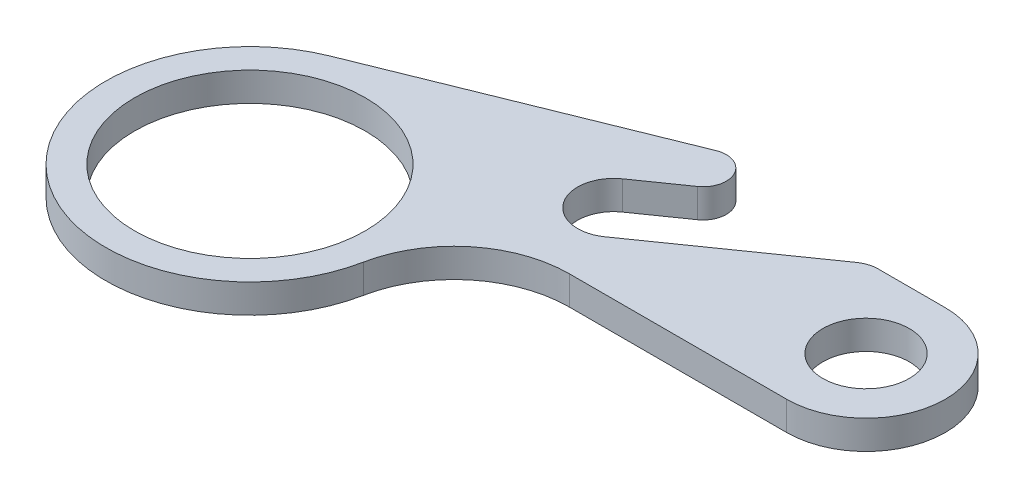
ISO-10303-21;
HEADER;
FILE_DESCRIPTION(('STEP AP214'),'2;1');
FILE_NAME('part.step','',(''),(''),'','','');
FILE_SCHEMA(('AUTOMOTIVE_DESIGN { 1 0 10303 214 1 1 1 1 }'));
ENDSEC;
DATA;
#1=APPLICATION_CONTEXT('core data for automotive mechanical design processes');
#2=APPLICATION_PROTOCOL_DEFINITION('international standard','automotive_design',2000,#1);
#3=PRODUCT_CONTEXT('',#1,'mechanical');
#4=PRODUCT('Part','Part','',(#3));
#5=PRODUCT_RELATED_PRODUCT_CATEGORY('part','',(#4));
#6=PRODUCT_DEFINITION_FORMATION('','',#4);
#7=PRODUCT_DEFINITION_CONTEXT('part definition',#1,'design');
#8=PRODUCT_DEFINITION('design','',#6,#7);
#9=PRODUCT_DEFINITION_SHAPE('','',#8);
#10=(LENGTH_UNIT() NAMED_UNIT(*) SI_UNIT(.MILLI.,.METRE.));
#11=(NAMED_UNIT(*) PLANE_ANGLE_UNIT() SI_UNIT($,.RADIAN.));
#12=(NAMED_UNIT(*) SI_UNIT($,.STERADIAN.) SOLID_ANGLE_UNIT());
#13=UNCERTAINTY_MEASURE_WITH_UNIT(LENGTH_MEASURE(1.E-05),#10,'distance_accuracy_value','');
#14=(GEOMETRIC_REPRESENTATION_CONTEXT(3) GLOBAL_UNCERTAINTY_ASSIGNED_CONTEXT((#13)) GLOBAL_UNIT_ASSIGNED_CONTEXT((#10,
#11,#12)) REPRESENTATION_CONTEXT('',''));
#15=CARTESIAN_POINT('',(0.,0.,0.));
#16=DIRECTION('',(0.,0.,1.));
#17=DIRECTION('',(1.,0.,0.));
#18=AXIS2_PLACEMENT_3D('',#15,#16,#17);
#19=CARTESIAN_POINT('',(-27.7685453845651,2.54,-3.11991027531075));
#20=DIRECTION('',(0.,-1.,0.));
#21=DIRECTION('',(0.,0.,-1.));
#22=AXIS2_PLACEMENT_3D('',#19,#20,#21);
#23=PLANE('',#22);
#24=CARTESIAN_POINT('',(-27.7685453845651,2.54,-3.11991027531075));
#25=DIRECTION('',(0.,1.,0.));
#26=DIRECTION('',(0.,0.,-1.));
#27=AXIS2_PLACEMENT_3D('',#24,#25,#26);
#28=CIRCLE('',#27,1.524);
#29=CARTESIAN_POINT('',(-26.8944148955661,2.54,-1.87152255981432));
#30=VERTEX_POINT('',#29);
#31=CARTESIAN_POINT('',(-28.339592887485,2.54,-4.53287904687259));
#32=VERTEX_POINT('',#31);
#33=EDGE_CURVE('E171',#30,#32,#28,.T.);
#34=ORIENTED_EDGE('',*,*,#33,.T.);
#35=DIRECTION('',(-0.927144863229556,0.,0.374703085905425));
#36=VECTOR('',#35,1.);
#37=CARTESIAN_POINT('',(-46.5153028129786,2.54,2.81278490242774));
#38=LINE('',#37,#36);
#39=CARTESIAN_POINT('',(-46.5153028129786,2.54,2.81278490242774));
#40=VERTEX_POINT('',#39);
#41=EDGE_CURVE('E104',#32,#40,#38,.T.);
#42=ORIENTED_EDGE('',*,*,#41,.T.);
#43=CARTESIAN_POINT('',(-42.9462559197294,2.54,11.6438397246893));
#44=DIRECTION('',(0.,1.,0.));
#45=DIRECTION('',(0.,0.,1.));
#46=AXIS2_PLACEMENT_3D('',#43,#44,#45);
#47=CIRCLE('',#46,9.525);
#48=CARTESIAN_POINT('',(-33.6030545237202,2.54,13.4959230580226));
#49=VERTEX_POINT('',#48);
#50=EDGE_CURVE('E195',#40,#49,#47,.T.);
#51=ORIENTED_EDGE('',*,*,#50,.T.);
#52=CARTESIAN_POINT('',(-26.1284934069128,2.54,14.9775897246893));
#53=DIRECTION('',(0.,-1.,0.));
#54=DIRECTION('',(0.,0.,-1.));
#55=AXIS2_PLACEMENT_3D('',#52,#53,#54);
#56=CIRCLE('',#55,7.62);
#57=CARTESIAN_POINT('',(-26.1284934069128,2.54,7.35758972468925));
#58=VERTEX_POINT('',#57);
#59=EDGE_CURVE('E214',#49,#58,#56,.T.);
#60=ORIENTED_EDGE('',*,*,#59,.T.);
#61=DIRECTION('',(1.,0.,0.));
#62=VECTOR('',#61,1.);
#63=CARTESIAN_POINT('',(-11.7729101562861,2.54,7.35758972468925));
#64=LINE('',#63,#62);
#65=CARTESIAN_POINT('',(-11.7729101562861,2.54,7.35758972468925));
#66=VERTEX_POINT('',#65);
#67=EDGE_CURVE('E211',#58,#66,#64,.T.);
#68=ORIENTED_EDGE('',*,*,#67,.T.);
#69=CARTESIAN_POINT('',(-11.7729101562861,2.54,2.11883972468925));
#70=DIRECTION('',(0.,1.,0.));
#71=DIRECTION('',(0.,0.,1.));
#72=AXIS2_PLACEMENT_3D('',#69,#70,#71);
#73=CIRCLE('',#72,5.23875);
#74=CARTESIAN_POINT('',(-11.7729101562861,2.54,-3.11991027531074));
#75=VERTEX_POINT('',#74);
#76=EDGE_CURVE('E213',#66,#75,#73,.T.);
#77=ORIENTED_EDGE('',*,*,#76,.T.);
#78=DIRECTION('',(-1.,0.,0.));
#79=VECTOR('',#78,1.);
#80=CARTESIAN_POINT('',(-11.7729101562861,2.54,-3.11991027531075));
#81=LINE('',#80,#79);
#82=CARTESIAN_POINT('',(-16.2077229110785,2.54,-3.11991027531074));
#83=VERTEX_POINT('',#82);
#84=EDGE_CURVE('E216',#75,#83,#81,.T.);
#85=ORIENTED_EDGE('',*,*,#84,.T.);
#86=CARTESIAN_POINT('',(-16.2077229110785,2.54,-1.21491027531075));
#87=DIRECTION('',(0.,1.,0.));
#88=DIRECTION('',(0.,0.,-1.));
#89=AXIS2_PLACEMENT_3D('',#86,#87,#88);
#90=CIRCLE('',#89,1.90500000000001);
#91=CARTESIAN_POINT('',(-17.3003860223273,2.54,-2.77539491968127));
#92=VERTEX_POINT('',#91);
#93=EDGE_CURVE('E132',#83,#92,#90,.T.);
#94=ORIENTED_EDGE('',*,*,#93,.T.);
#95=DIRECTION('',(-0.819152044288994,0.,0.573576436351042));
#96=VECTOR('',#95,1.);
#97=CARTESIAN_POINT('',(-27.0758312672252,2.54,4.06944553015243));
#98=LINE('',#97,#96);
#99=CARTESIAN_POINT('',(-27.0758312672252,2.54,4.06944553015243));
#100=VERTEX_POINT('',#99);
#101=EDGE_CURVE('E126',#92,#100,#98,.T.);
#102=ORIENTED_EDGE('',*,*,#101,.T.);
#103=CARTESIAN_POINT('',(-28.4416601562861,2.54,2.11883972468926));
#104=DIRECTION('',(0.,-1.,0.));
#105=DIRECTION('',(0.,0.,1.));
#106=AXIS2_PLACEMENT_3D('',#103,#104,#105);
#107=CIRCLE('',#106,2.38125);
#108=CARTESIAN_POINT('',(-29.807489045347,2.54,0.168233919226087));
#109=VERTEX_POINT('',#108);
#110=EDGE_CURVE('E130',#100,#109,#107,.T.);
#111=ORIENTED_EDGE('',*,*,#110,.T.);
#112=DIRECTION('',(0.819152044288994,0.,-0.573576436351042));
#113=VECTOR('',#112,1.);
#114=CARTESIAN_POINT('',(-29.807489045347,2.54,0.168233919226091));
#115=LINE('',#114,#113);
#116=EDGE_CURVE('E52',#109,#30,#115,.T.);
#117=ORIENTED_EDGE('',*,*,#116,.T.);
#118=EDGE_LOOP('',(#34,#42,#51,#60,#68,#77,#85,#94,#102,#111,#117));
#119=FACE_BOUND('',#118,.T.);
#120=CARTESIAN_POINT('',(-11.7729101562861,2.54,2.11883972468925));
#121=DIRECTION('',(0.,1.,0.));
#122=DIRECTION('',(0.,0.,1.));
#123=AXIS2_PLACEMENT_3D('',#120,#121,#122);
#124=CIRCLE('',#123,2.8575);
#125=CARTESIAN_POINT('',(-11.7729101562861,2.54,4.97633972468925));
#126=VERTEX_POINT('',#125);
#127=EDGE_CURVE('E154',#126,#126,#124,.T.);
#128=ORIENTED_EDGE('',*,*,#127,.F.);
#129=EDGE_LOOP('',(#128));
#130=FACE_BOUND('',#129,.T.);
#131=CARTESIAN_POINT('',(-42.9462559197294,2.54,11.6438397246893));
#132=DIRECTION('',(0.,1.,0.));
#133=DIRECTION('',(0.,0.,1.));
#134=AXIS2_PLACEMENT_3D('',#131,#132,#133);
#135=CIRCLE('',#134,7.62);
#136=CARTESIAN_POINT('',(-42.9462559197294,2.54,19.2638397246893));
#137=VERTEX_POINT('',#136);
#138=EDGE_CURVE('E260',#137,#137,#135,.T.);
#139=ORIENTED_EDGE('',*,*,#138,.F.);
#140=EDGE_LOOP('',(#139));
#141=FACE_BOUND('',#140,.T.);
#142=ADVANCED_FACE('F35',(#119,#130,#141),#23,.F.);
#143=CARTESIAN_POINT('',(-27.7685453845651,0.635,-3.11991027531075));
#144=DIRECTION('',(0.,-1.,0.));
#145=DIRECTION('',(0.,0.,-1.));
#146=AXIS2_PLACEMENT_3D('',#143,#144,#145);
#147=PLANE('',#146);
#148=CARTESIAN_POINT('',(-11.7729101562861,0.635,2.11883972468925));
#149=DIRECTION('',(0.,1.,0.));
#150=DIRECTION('',(0.,0.,1.));
#151=AXIS2_PLACEMENT_3D('',#148,#149,#150);
#152=CIRCLE('',#151,2.8575);
#153=CARTESIAN_POINT('',(-11.7729101562861,0.635,4.97633972468925));
#154=VERTEX_POINT('',#153);
#155=EDGE_CURVE('E265',#154,#154,#152,.T.);
#156=ORIENTED_EDGE('',*,*,#155,.T.);
#157=EDGE_LOOP('',(#156));
#158=FACE_BOUND('',#157,.T.);
#159=CARTESIAN_POINT('',(-27.7685453845651,0.635,-3.11991027531075));
#160=DIRECTION('',(0.,1.,0.));
#161=DIRECTION('',(0.,0.,-1.));
#162=AXIS2_PLACEMENT_3D('',#159,#160,#161);
#163=CIRCLE('',#162,1.524);
#164=CARTESIAN_POINT('',(-26.8944148955661,0.635,-1.87152255981432));
#165=VERTEX_POINT('',#164);
#166=CARTESIAN_POINT('',(-28.339592887485,0.635,-4.53287904687259));
#167=VERTEX_POINT('',#166);
#168=EDGE_CURVE('E150',#165,#167,#163,.T.);
#169=ORIENTED_EDGE('',*,*,#168,.F.);
#170=DIRECTION('',(0.819152044288994,0.,-0.573576436351042));
#171=VECTOR('',#170,1.);
#172=CARTESIAN_POINT('',(-29.807489045347,0.635,0.168233919226091));
#173=LINE('',#172,#171);
#174=CARTESIAN_POINT('',(-29.807489045347,0.635,0.168233919226087));
#175=VERTEX_POINT('',#174);
#176=EDGE_CURVE('E96',#175,#165,#173,.T.);
#177=ORIENTED_EDGE('',*,*,#176,.F.);
#178=CARTESIAN_POINT('',(-28.4416601562861,0.635,2.11883972468926));
#179=DIRECTION('',(0.,-1.,0.));
#180=DIRECTION('',(0.,0.,1.));
#181=AXIS2_PLACEMENT_3D('',#178,#179,#180);
#182=CIRCLE('',#181,2.38125);
#183=CARTESIAN_POINT('',(-27.0758312672252,0.635,4.06944553015243));
#184=VERTEX_POINT('',#183);
#185=EDGE_CURVE('E90',#184,#175,#182,.T.);
#186=ORIENTED_EDGE('',*,*,#185,.F.);
#187=DIRECTION('',(-0.819152044288994,0.,0.573576436351042));
#188=VECTOR('',#187,1.);
#189=CARTESIAN_POINT('',(-27.0758312672252,0.635,4.06944553015243));
#190=LINE('',#189,#188);
#191=CARTESIAN_POINT('',(-17.3003860223273,0.635,-2.77539491968127));
#192=VERTEX_POINT('',#191);
#193=EDGE_CURVE('E140',#192,#184,#190,.T.);
#194=ORIENTED_EDGE('',*,*,#193,.F.);
#195=CARTESIAN_POINT('',(-16.2077229110785,0.635,-1.21491027531075));
#196=DIRECTION('',(0.,1.,0.));
#197=DIRECTION('',(0.,0.,-1.));
#198=AXIS2_PLACEMENT_3D('',#195,#196,#197);
#199=CIRCLE('',#198,1.90500000000001);
#200=CARTESIAN_POINT('',(-16.2077229110785,0.635,-3.11991027531074));
#201=VERTEX_POINT('',#200);
#202=EDGE_CURVE('E166',#201,#192,#199,.T.);
#203=ORIENTED_EDGE('',*,*,#202,.F.);
#204=DIRECTION('',(-1.,0.,0.));
#205=VECTOR('',#204,1.);
#206=CARTESIAN_POINT('',(-11.7729101562861,0.635,-3.11991027531075));
#207=LINE('',#206,#205);
#208=CARTESIAN_POINT('',(-11.7729101562861,0.635,-3.11991027531074));
#209=VERTEX_POINT('',#208);
#210=EDGE_CURVE('E164',#209,#201,#207,.T.);
#211=ORIENTED_EDGE('',*,*,#210,.F.);
#212=CARTESIAN_POINT('',(-11.7729101562861,0.635,2.11883972468925));
#213=DIRECTION('',(0.,1.,0.));
#214=DIRECTION('',(0.,0.,1.));
#215=AXIS2_PLACEMENT_3D('',#212,#213,#214);
#216=CIRCLE('',#215,5.23875);
#217=CARTESIAN_POINT('',(-11.7729101562861,0.635,7.35758972468925));
#218=VERTEX_POINT('',#217);
#219=EDGE_CURVE('E162',#218,#209,#216,.T.);
#220=ORIENTED_EDGE('',*,*,#219,.F.);
#221=DIRECTION('',(1.,0.,0.));
#222=VECTOR('',#221,1.);
#223=CARTESIAN_POINT('',(-11.7729101562861,0.635,7.35758972468925));
#224=LINE('',#223,#222);
#225=CARTESIAN_POINT('',(-26.1284934069128,0.635,7.35758972468925));
#226=VERTEX_POINT('',#225);
#227=EDGE_CURVE('E160',#226,#218,#224,.T.);
#228=ORIENTED_EDGE('',*,*,#227,.F.);
#229=CARTESIAN_POINT('',(-26.1284934069128,0.635,14.9775897246893));
#230=DIRECTION('',(0.,-1.,0.));
#231=DIRECTION('',(0.,0.,-1.));
#232=AXIS2_PLACEMENT_3D('',#229,#230,#231);
#233=CIRCLE('',#232,7.62);
#234=CARTESIAN_POINT('',(-33.6030545237202,0.635,13.4959230580226));
#235=VERTEX_POINT('',#234);
#236=EDGE_CURVE('E158',#235,#226,#233,.T.);
#237=ORIENTED_EDGE('',*,*,#236,.F.);
#238=CARTESIAN_POINT('',(-42.9462559197294,0.635,11.6438397246893));
#239=DIRECTION('',(0.,1.,0.));
#240=DIRECTION('',(0.,0.,1.));
#241=AXIS2_PLACEMENT_3D('',#238,#239,#240);
#242=CIRCLE('',#241,9.525);
#243=CARTESIAN_POINT('',(-46.5153028129786,0.635,2.81278490242774));
#244=VERTEX_POINT('',#243);
#245=EDGE_CURVE('E156',#244,#235,#242,.T.);
#246=ORIENTED_EDGE('',*,*,#245,.F.);
#247=DIRECTION('',(-0.927144863229556,0.,0.374703085905425));
#248=VECTOR('',#247,1.);
#249=CARTESIAN_POINT('',(-46.5153028129786,0.635,2.81278490242774));
#250=LINE('',#249,#248);
#251=EDGE_CURVE('E153',#167,#244,#250,.T.);
#252=ORIENTED_EDGE('',*,*,#251,.F.);
#253=EDGE_LOOP('',(#169,#177,#186,#194,#203,#211,#220,#228,#237,#246,#252));
#254=FACE_BOUND('',#253,.T.);
#255=CARTESIAN_POINT('',(-42.9462559197294,0.635,11.6438397246893));
#256=DIRECTION('',(0.,1.,0.));
#257=DIRECTION('',(0.,0.,1.));
#258=AXIS2_PLACEMENT_3D('',#255,#256,#257);
#259=CIRCLE('',#258,7.62);
#260=CARTESIAN_POINT('',(-42.9462559197294,0.635,19.2638397246893));
#261=VERTEX_POINT('',#260);
#262=EDGE_CURVE('E263',#261,#261,#259,.T.);
#263=ORIENTED_EDGE('',*,*,#262,.T.);
#264=EDGE_LOOP('',(#263));
#265=FACE_BOUND('',#264,.T.);
#266=ADVANCED_FACE('F199',(#158,#254,#265),#147,.T.);
#267=CARTESIAN_POINT('',(-27.7685453845651,2.54,-3.11991027531075));
#268=DIRECTION('',(0.,-1.,0.));
#269=DIRECTION('',(0.,0.,-1.));
#270=AXIS2_PLACEMENT_3D('',#267,#268,#269);
#271=CYLINDRICAL_SURFACE('',#270,1.524);
#272=ORIENTED_EDGE('',*,*,#168,.T.);
#273=DIRECTION('',(0.,-1.,0.));
#274=VECTOR('',#273,1.);
#275=CARTESIAN_POINT('',(-28.339592887485,2.54,-4.53287904687259));
#276=LINE('',#275,#274);
#277=EDGE_CURVE('E11',#32,#167,#276,.T.);
#278=ORIENTED_EDGE('',*,*,#277,.F.);
#279=ORIENTED_EDGE('',*,*,#33,.F.);
#280=DIRECTION('',(0.,-1.,0.));
#281=VECTOR('',#280,1.);
#282=CARTESIAN_POINT('',(-26.8944148955661,2.54,-1.87152255981432));
#283=LINE('',#282,#281);
#284=EDGE_CURVE('E146',#30,#165,#283,.T.);
#285=ORIENTED_EDGE('',*,*,#284,.T.);
#286=EDGE_LOOP('',(#272,#278,#279,#285));
#287=FACE_BOUND('',#286,.T.);
#288=ADVANCED_FACE('F37',(#287),#271,.T.);
#289=CARTESIAN_POINT('',(-46.5153028129786,2.54,2.81278490242774));
#290=DIRECTION('',(0.374703085905425,0.,0.927144863229556));
#291=DIRECTION('',(0.927144863229556,0.,-0.374703085905425));
#292=AXIS2_PLACEMENT_3D('',#289,#290,#291);
#293=PLANE('',#292);
#294=ORIENTED_EDGE('',*,*,#251,.T.);
#295=DIRECTION('',(0.,-1.,0.));
#296=VECTOR('',#295,1.);
#297=CARTESIAN_POINT('',(-46.5153028129786,2.54,2.81278490242774));
#298=LINE('',#297,#296);
#299=EDGE_CURVE('E44',#40,#244,#298,.T.);
#300=ORIENTED_EDGE('',*,*,#299,.F.);
#301=ORIENTED_EDGE('',*,*,#41,.F.);
#302=ORIENTED_EDGE('',*,*,#277,.T.);
#303=EDGE_LOOP('',(#294,#300,#301,#302));
#304=FACE_BOUND('',#303,.T.);
#305=ADVANCED_FACE('F350',(#304),#293,.F.);
#306=CARTESIAN_POINT('',(-42.9462559197294,2.54,11.6438397246893));
#307=DIRECTION('',(0.,-1.,0.));
#308=DIRECTION('',(0.,0.,-1.));
#309=AXIS2_PLACEMENT_3D('',#306,#307,#308);
#310=CYLINDRICAL_SURFACE('',#309,9.525);
#311=ORIENTED_EDGE('',*,*,#245,.T.);
#312=DIRECTION('',(0.,-1.,0.));
#313=VECTOR('',#312,1.);
#314=CARTESIAN_POINT('',(-33.6030545237202,2.54,13.4959230580226));
#315=LINE('',#314,#313);
#316=EDGE_CURVE('E187',#49,#235,#315,.T.);
#317=ORIENTED_EDGE('',*,*,#316,.F.);
#318=ORIENTED_EDGE('',*,*,#50,.F.);
#319=ORIENTED_EDGE('',*,*,#299,.T.);
#320=EDGE_LOOP('',(#311,#317,#318,#319));
#321=FACE_BOUND('',#320,.T.);
#322=ADVANCED_FACE('F193',(#321),#310,.T.);
#323=CARTESIAN_POINT('',(-26.1284934069128,2.54,14.9775897246893));
#324=DIRECTION('',(0.,-1.,0.));
#325=DIRECTION('',(0.,0.,-1.));
#326=AXIS2_PLACEMENT_3D('',#323,#324,#325);
#327=CYLINDRICAL_SURFACE('',#326,7.62);
#328=ORIENTED_EDGE('',*,*,#236,.T.);
#329=DIRECTION('',(0.,-1.,0.));
#330=VECTOR('',#329,1.);
#331=CARTESIAN_POINT('',(-26.1284934069128,2.54,7.35758972468925));
#332=LINE('',#331,#330);
#333=EDGE_CURVE('E184',#58,#226,#332,.T.);
#334=ORIENTED_EDGE('',*,*,#333,.F.);
#335=ORIENTED_EDGE('',*,*,#59,.F.);
#336=ORIENTED_EDGE('',*,*,#316,.T.);
#337=EDGE_LOOP('',(#328,#334,#335,#336));
#338=FACE_BOUND('',#337,.T.);
#339=ADVANCED_FACE('F205',(#338),#327,.F.);
#340=CARTESIAN_POINT('',(-11.7729101562861,2.54,7.35758972468925));
#341=DIRECTION('',(0.,0.,-1.));
#342=DIRECTION('',(-1.,0.,0.));
#343=AXIS2_PLACEMENT_3D('',#340,#341,#342);
#344=PLANE('',#343);
#345=ORIENTED_EDGE('',*,*,#227,.T.);
#346=DIRECTION('',(0.,-1.,0.));
#347=VECTOR('',#346,1.);
#348=CARTESIAN_POINT('',(-11.7729101562861,2.54,7.35758972468925));
#349=LINE('',#348,#347);
#350=EDGE_CURVE('E181',#66,#218,#349,.T.);
#351=ORIENTED_EDGE('',*,*,#350,.F.);
#352=ORIENTED_EDGE('',*,*,#67,.F.);
#353=ORIENTED_EDGE('',*,*,#333,.T.);
#354=EDGE_LOOP('',(#345,#351,#352,#353));
#355=FACE_BOUND('',#354,.T.);
#356=ADVANCED_FACE('F209',(#355),#344,.F.);
#357=CARTESIAN_POINT('',(-11.7729101562861,2.54,2.11883972468925));
#358=DIRECTION('',(0.,-1.,0.));
#359=DIRECTION('',(0.,0.,-1.));
#360=AXIS2_PLACEMENT_3D('',#357,#358,#359);
#361=CYLINDRICAL_SURFACE('',#360,5.23875);
#362=ORIENTED_EDGE('',*,*,#219,.T.);
#363=DIRECTION('',(0.,-1.,0.));
#364=VECTOR('',#363,1.);
#365=CARTESIAN_POINT('',(-11.7729101562861,2.54,-3.11991027531074));
#366=LINE('',#365,#364);
#367=EDGE_CURVE('E178',#75,#209,#366,.T.);
#368=ORIENTED_EDGE('',*,*,#367,.F.);
#369=ORIENTED_EDGE('',*,*,#76,.F.);
#370=ORIENTED_EDGE('',*,*,#350,.T.);
#371=EDGE_LOOP('',(#362,#368,#369,#370));
#372=FACE_BOUND('',#371,.T.);
#373=ADVANCED_FACE('F316',(#372),#361,.T.);
#374=CARTESIAN_POINT('',(-11.7729101562861,2.54,-3.11991027531075));
#375=DIRECTION('',(0.,0.,1.));
#376=DIRECTION('',(1.,0.,0.));
#377=AXIS2_PLACEMENT_3D('',#374,#375,#376);
#378=PLANE('',#377);
#379=ORIENTED_EDGE('',*,*,#210,.T.);
#380=DIRECTION('',(0.,-1.,0.));
#381=VECTOR('',#380,1.);
#382=CARTESIAN_POINT('',(-16.2077229110785,2.54,-3.11991027531074));
#383=LINE('',#382,#381);
#384=EDGE_CURVE('E175',#83,#201,#383,.T.);
#385=ORIENTED_EDGE('',*,*,#384,.F.);
#386=ORIENTED_EDGE('',*,*,#84,.F.);
#387=ORIENTED_EDGE('',*,*,#367,.T.);
#388=EDGE_LOOP('',(#379,#385,#386,#387));
#389=FACE_BOUND('',#388,.T.);
#390=ADVANCED_FACE('F225',(#389),#378,.F.);
#391=CARTESIAN_POINT('',(-16.2077229110785,2.54,-1.21491027531075));
#392=DIRECTION('',(0.,-1.,0.));
#393=DIRECTION('',(0.,0.,-1.));
#394=AXIS2_PLACEMENT_3D('',#391,#392,#393);
#395=CYLINDRICAL_SURFACE('',#394,1.90500000000001);
#396=ORIENTED_EDGE('',*,*,#202,.T.);
#397=DIRECTION('',(0.,-1.,0.));
#398=VECTOR('',#397,1.);
#399=CARTESIAN_POINT('',(-17.3003860223273,2.54,-2.77539491968127));
#400=LINE('',#399,#398);
#401=EDGE_CURVE('E141',#92,#192,#400,.T.);
#402=ORIENTED_EDGE('',*,*,#401,.F.);
#403=ORIENTED_EDGE('',*,*,#93,.F.);
#404=ORIENTED_EDGE('',*,*,#384,.T.);
#405=EDGE_LOOP('',(#396,#402,#403,#404));
#406=FACE_BOUND('',#405,.T.);
#407=ADVANCED_FACE('F229',(#406),#395,.T.);
#408=CARTESIAN_POINT('',(-27.0758312672252,2.54,4.06944553015243));
#409=DIRECTION('',(0.573576436351042,0.,0.819152044288994));
#410=DIRECTION('',(0.819152044288995,0.,-0.573576436351042));
#411=AXIS2_PLACEMENT_3D('',#408,#409,#410);
#412=PLANE('',#411);
#413=ORIENTED_EDGE('',*,*,#193,.T.);
#414=DIRECTION('',(0.,-1.,0.));
#415=VECTOR('',#414,1.);
#416=CARTESIAN_POINT('',(-27.0758312672252,2.54,4.06944553015243));
#417=LINE('',#416,#415);
#418=EDGE_CURVE('E137',#100,#184,#417,.T.);
#419=ORIENTED_EDGE('',*,*,#418,.F.);
#420=ORIENTED_EDGE('',*,*,#101,.F.);
#421=ORIENTED_EDGE('',*,*,#401,.T.);
#422=EDGE_LOOP('',(#413,#419,#420,#421));
#423=FACE_BOUND('',#422,.T.);
#424=ADVANCED_FACE('F138',(#423),#412,.F.);
#425=CARTESIAN_POINT('',(-28.4416601562861,2.54,2.11883972468926));
#426=DIRECTION('',(0.,-1.,0.));
#427=DIRECTION('',(0.,0.,-1.));
#428=AXIS2_PLACEMENT_3D('',#425,#426,#427);
#429=CYLINDRICAL_SURFACE('',#428,2.38125);
#430=ORIENTED_EDGE('',*,*,#185,.T.);
#431=DIRECTION('',(0.,-1.,0.));
#432=VECTOR('',#431,1.);
#433=CARTESIAN_POINT('',(-29.807489045347,2.54,0.168233919226087));
#434=LINE('',#433,#432);
#435=EDGE_CURVE('E142',#109,#175,#434,.T.);
#436=ORIENTED_EDGE('',*,*,#435,.F.);
#437=ORIENTED_EDGE('',*,*,#110,.F.);
#438=ORIENTED_EDGE('',*,*,#418,.T.);
#439=EDGE_LOOP('',(#430,#436,#437,#438));
#440=FACE_BOUND('',#439,.T.);
#441=ADVANCED_FACE('F144',(#440),#429,.F.);
#442=CARTESIAN_POINT('',(-29.807489045347,2.54,0.168233919226091));
#443=DIRECTION('',(-0.573576436351042,0.,-0.819152044288994));
#444=DIRECTION('',(-0.819152044288994,0.,0.573576436351042));
#445=AXIS2_PLACEMENT_3D('',#442,#443,#444);
#446=PLANE('',#445);
#447=ORIENTED_EDGE('',*,*,#176,.T.);
#448=ORIENTED_EDGE('',*,*,#284,.F.);
#449=ORIENTED_EDGE('',*,*,#116,.F.);
#450=ORIENTED_EDGE('',*,*,#435,.T.);
#451=EDGE_LOOP('',(#447,#448,#449,#450));
#452=FACE_BOUND('',#451,.T.);
#453=ADVANCED_FACE('F233',(#452),#446,.F.);
#454=CARTESIAN_POINT('',(-11.7729101562861,2.54,2.11883972468925));
#455=DIRECTION('',(0.,-1.,0.));
#456=DIRECTION('',(0.,0.,-1.));
#457=AXIS2_PLACEMENT_3D('',#454,#455,#456);
#458=CYLINDRICAL_SURFACE('',#457,2.8575);
#459=ORIENTED_EDGE('',*,*,#127,.T.);
#460=EDGE_LOOP('',(#459));
#461=FACE_BOUND('',#460,.T.);
#462=ORIENTED_EDGE('',*,*,#155,.F.);
#463=EDGE_LOOP('',(#462));
#464=FACE_BOUND('',#463,.T.);
#465=ADVANCED_FACE('F235',(#461,#464),#458,.F.);
#466=CARTESIAN_POINT('',(-42.9462559197294,2.54,11.6438397246893));
#467=DIRECTION('',(0.,-1.,0.));
#468=DIRECTION('',(0.,0.,-1.));
#469=AXIS2_PLACEMENT_3D('',#466,#467,#468);
#470=CYLINDRICAL_SURFACE('',#469,7.62);
#471=ORIENTED_EDGE('',*,*,#138,.T.);
#472=EDGE_LOOP('',(#471));
#473=FACE_BOUND('',#472,.T.);
#474=ORIENTED_EDGE('',*,*,#262,.F.);
#475=EDGE_LOOP('',(#474));
#476=FACE_BOUND('',#475,.T.);
#477=ADVANCED_FACE('F241',(#473,#476),#470,.F.);
#478=CLOSED_SHELL('',(#142,#266,#288,#305,#322,#339,#356,#373,#390,#407,#424,#441,#453,#465,#477));
#479=MANIFOLD_SOLID_BREP('B2',#478);
#480=ADVANCED_BREP_SHAPE_REPRESENTATION('',(#18,#479),#14);
#481=SHAPE_DEFINITION_REPRESENTATION(#9,#480);
ENDSEC;
END-ISO-10303-21;
